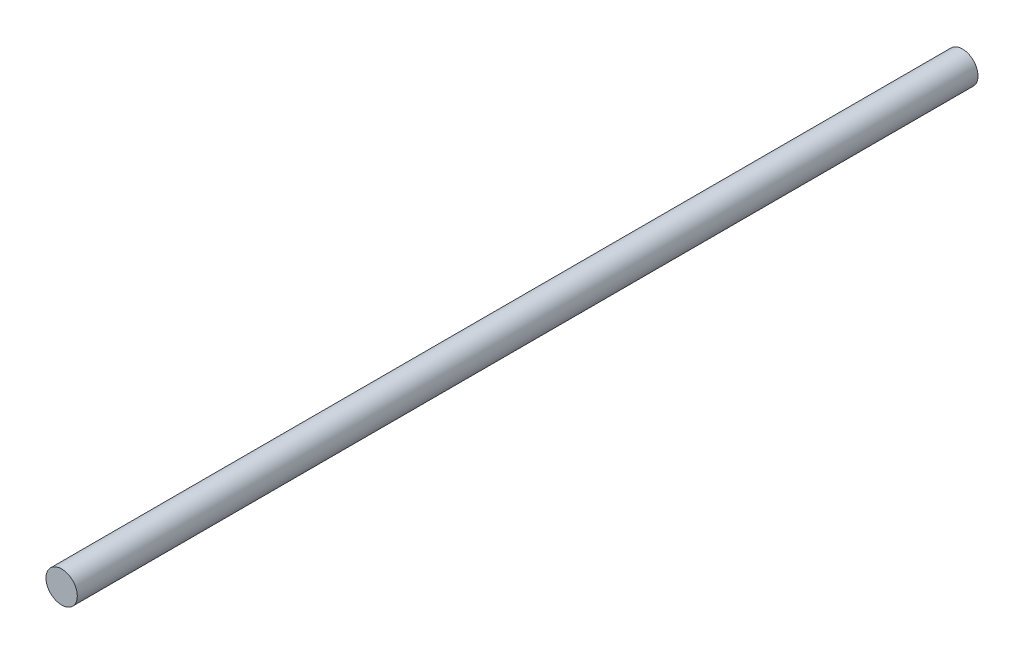
ISO-10303-21;
HEADER;
FILE_DESCRIPTION(('STEP AP214'),'2;1');
FILE_NAME('part.step','',(''),(''),'','','');
FILE_SCHEMA(('AUTOMOTIVE_DESIGN { 1 0 10303 214 1 1 1 1 }'));
ENDSEC;
DATA;
#1=APPLICATION_CONTEXT('core data for automotive mechanical design processes');
#2=APPLICATION_PROTOCOL_DEFINITION('international standard','automotive_design',2000,#1);
#3=PRODUCT_CONTEXT('',#1,'mechanical');
#4=PRODUCT('Part','Part','',(#3));
#5=PRODUCT_RELATED_PRODUCT_CATEGORY('part','',(#4));
#6=PRODUCT_DEFINITION_FORMATION('','',#4);
#7=PRODUCT_DEFINITION_CONTEXT('part definition',#1,'design');
#8=PRODUCT_DEFINITION('design','',#6,#7);
#9=PRODUCT_DEFINITION_SHAPE('','',#8);
#10=(LENGTH_UNIT() NAMED_UNIT(*) SI_UNIT(.MILLI.,.METRE.));
#11=(NAMED_UNIT(*) PLANE_ANGLE_UNIT() SI_UNIT($,.RADIAN.));
#12=(NAMED_UNIT(*) SI_UNIT($,.STERADIAN.) SOLID_ANGLE_UNIT());
#13=UNCERTAINTY_MEASURE_WITH_UNIT(LENGTH_MEASURE(1.E-05),#10,'distance_accuracy_value','');
#14=(GEOMETRIC_REPRESENTATION_CONTEXT(3) GLOBAL_UNCERTAINTY_ASSIGNED_CONTEXT((#13)) GLOBAL_UNIT_ASSIGNED_CONTEXT((#10,
#11,#12)) REPRESENTATION_CONTEXT('',''));
#15=CARTESIAN_POINT('',(0.,0.,0.));
#16=DIRECTION('',(0.,0.,1.));
#17=DIRECTION('',(1.,0.,0.));
#18=AXIS2_PLACEMENT_3D('',#15,#16,#17);
#19=CARTESIAN_POINT('',(0.,0.,230.));
#20=DIRECTION('',(0.,0.,-1.));
#21=DIRECTION('',(-1.,0.,0.));
#22=AXIS2_PLACEMENT_3D('',#19,#20,#21);
#23=CYLINDRICAL_SURFACE('',#22,4.);
#24=CARTESIAN_POINT('',(0.,0.,230.));
#25=DIRECTION('',(0.,0.,1.));
#26=DIRECTION('',(1.,0.,0.));
#27=AXIS2_PLACEMENT_3D('',#24,#25,#26);
#28=CIRCLE('',#27,4.);
#29=CARTESIAN_POINT('',(4.,0.,230.));
#30=VERTEX_POINT('',#29);
#31=EDGE_CURVE('E10',#30,#30,#28,.T.);
#32=ORIENTED_EDGE('',*,*,#31,.F.);
#33=EDGE_LOOP('',(#32));
#34=FACE_BOUND('',#33,.T.);
#35=CARTESIAN_POINT('',(0.,0.,0.));
#36=DIRECTION('',(0.,0.,1.));
#37=DIRECTION('',(1.,0.,0.));
#38=AXIS2_PLACEMENT_3D('',#35,#36,#37);
#39=CIRCLE('',#38,4.);
#40=CARTESIAN_POINT('',(4.,0.,0.));
#41=VERTEX_POINT('',#40);
#42=EDGE_CURVE('E34',#41,#41,#39,.T.);
#43=ORIENTED_EDGE('',*,*,#42,.T.);
#44=EDGE_LOOP('',(#43));
#45=FACE_BOUND('',#44,.T.);
#46=ADVANCED_FACE('F31',(#34,#45),#23,.T.);
#47=CARTESIAN_POINT('',(0.,0.,230.));
#48=DIRECTION('',(0.,0.,1.));
#49=DIRECTION('',(1.,0.,0.));
#50=AXIS2_PLACEMENT_3D('',#47,#48,#49);
#51=PLANE('',#50);
#52=ORIENTED_EDGE('',*,*,#31,.T.);
#53=EDGE_LOOP('',(#52));
#54=FACE_BOUND('',#53,.T.);
#55=ADVANCED_FACE('F46',(#54),#51,.T.);
#56=CARTESIAN_POINT('',(0.,0.,0.));
#57=DIRECTION('',(0.,0.,1.));
#58=DIRECTION('',(1.,0.,0.));
#59=AXIS2_PLACEMENT_3D('',#56,#57,#58);
#60=PLANE('',#59);
#61=ORIENTED_EDGE('',*,*,#42,.F.);
#62=EDGE_LOOP('',(#61));
#63=FACE_BOUND('',#62,.T.);
#64=ADVANCED_FACE('F44',(#63),#60,.F.);
#65=CLOSED_SHELL('',(#46,#55,#64));
#66=MANIFOLD_SOLID_BREP('B2',#65);
#67=ADVANCED_BREP_SHAPE_REPRESENTATION('',(#18,#66),#14);
#68=SHAPE_DEFINITION_REPRESENTATION(#9,#67);
ENDSEC;
END-ISO-10303-21;
